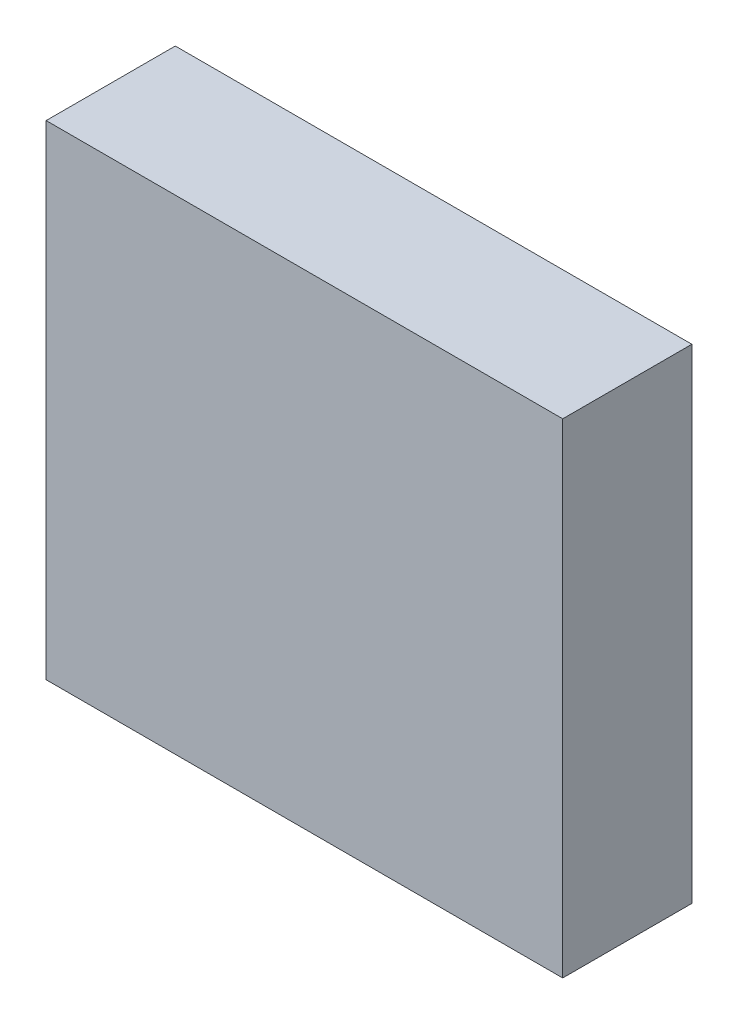
ISO-10303-21;
HEADER;
FILE_DESCRIPTION(('STEP AP214'),'2;1');
FILE_NAME('part.step','',(''),(''),'','','');
FILE_SCHEMA(('AUTOMOTIVE_DESIGN { 1 0 10303 214 1 1 1 1 }'));
ENDSEC;
DATA;
#1=APPLICATION_CONTEXT('core data for automotive mechanical design processes');
#2=APPLICATION_PROTOCOL_DEFINITION('international standard','automotive_design',2000,#1);
#3=PRODUCT_CONTEXT('',#1,'mechanical');
#4=PRODUCT('Part','Part','',(#3));
#5=PRODUCT_RELATED_PRODUCT_CATEGORY('part','',(#4));
#6=PRODUCT_DEFINITION_FORMATION('','',#4);
#7=PRODUCT_DEFINITION_CONTEXT('part definition',#1,'design');
#8=PRODUCT_DEFINITION('design','',#6,#7);
#9=PRODUCT_DEFINITION_SHAPE('','',#8);
#10=(LENGTH_UNIT() NAMED_UNIT(*) SI_UNIT(.MILLI.,.METRE.));
#11=(NAMED_UNIT(*) PLANE_ANGLE_UNIT() SI_UNIT($,.RADIAN.));
#12=(NAMED_UNIT(*) SI_UNIT($,.STERADIAN.) SOLID_ANGLE_UNIT());
#13=UNCERTAINTY_MEASURE_WITH_UNIT(LENGTH_MEASURE(1.E-05),#10,'distance_accuracy_value','');
#14=(GEOMETRIC_REPRESENTATION_CONTEXT(3) GLOBAL_UNCERTAINTY_ASSIGNED_CONTEXT((#13)) GLOBAL_UNIT_ASSIGNED_CONTEXT((#10,
#11,#12)) REPRESENTATION_CONTEXT('',''));
#15=CARTESIAN_POINT('',(0.,0.,0.));
#16=DIRECTION('',(0.,0.,1.));
#17=DIRECTION('',(1.,0.,0.));
#18=AXIS2_PLACEMENT_3D('',#15,#16,#17);
#19=CARTESIAN_POINT('',(0.,0.,0.8));
#20=DIRECTION('',(0.,0.,-1.));
#21=DIRECTION('',(0.,-1.,0.));
#22=AXIS2_PLACEMENT_3D('',#19,#20,#21);
#23=PLANE('',#22);
#24=DIRECTION('',(0.,1.,0.));
#25=VECTOR('',#24,1.);
#26=CARTESIAN_POINT('',(-1.6,-1.5,0.8));
#27=LINE('',#26,#25);
#28=CARTESIAN_POINT('',(-1.6,-1.5,0.8));
#29=VERTEX_POINT('',#28);
#30=CARTESIAN_POINT('',(-1.6,1.5,0.8));
#31=VERTEX_POINT('',#30);
#32=EDGE_CURVE('E27',#29,#31,#27,.T.);
#33=ORIENTED_EDGE('',*,*,#32,.F.);
#34=DIRECTION('',(-1.,0.,0.));
#35=VECTOR('',#34,1.);
#36=CARTESIAN_POINT('',(1.6,-1.5,0.8));
#37=LINE('',#36,#35);
#38=CARTESIAN_POINT('',(1.6,-1.5,0.8));
#39=VERTEX_POINT('',#38);
#40=EDGE_CURVE('E20',#39,#29,#37,.T.);
#41=ORIENTED_EDGE('',*,*,#40,.F.);
#42=DIRECTION('',(0.,-1.,0.));
#43=VECTOR('',#42,1.);
#44=CARTESIAN_POINT('',(1.6,1.5,0.8));
#45=LINE('',#44,#43);
#46=CARTESIAN_POINT('',(1.6,1.5,0.8));
#47=VERTEX_POINT('',#46);
#48=EDGE_CURVE('E85',#47,#39,#45,.T.);
#49=ORIENTED_EDGE('',*,*,#48,.F.);
#50=DIRECTION('',(1.,0.,0.));
#51=VECTOR('',#50,1.);
#52=CARTESIAN_POINT('',(-1.6,1.5,0.8));
#53=LINE('',#52,#51);
#54=EDGE_CURVE('E104',#31,#47,#53,.T.);
#55=ORIENTED_EDGE('',*,*,#54,.F.);
#56=EDGE_LOOP('',(#33,#41,#49,#55));
#57=FACE_BOUND('',#56,.T.);
#58=ADVANCED_FACE('F17',(#57),#23,.F.);
#59=CARTESIAN_POINT('',(0.,0.,0.));
#60=DIRECTION('',(0.,0.,-1.));
#61=DIRECTION('',(0.,-1.,0.));
#62=AXIS2_PLACEMENT_3D('',#59,#60,#61);
#63=PLANE('',#62);
#64=DIRECTION('',(1.,0.,0.));
#65=VECTOR('',#64,1.);
#66=CARTESIAN_POINT('',(-1.6,1.5,0.));
#67=LINE('',#66,#65);
#68=CARTESIAN_POINT('',(-1.6,1.5,0.));
#69=VERTEX_POINT('',#68);
#70=CARTESIAN_POINT('',(1.6,1.5,0.));
#71=VERTEX_POINT('',#70);
#72=EDGE_CURVE('E78',#69,#71,#67,.T.);
#73=ORIENTED_EDGE('',*,*,#72,.T.);
#74=DIRECTION('',(0.,-1.,0.));
#75=VECTOR('',#74,1.);
#76=CARTESIAN_POINT('',(1.6,1.5,0.));
#77=LINE('',#76,#75);
#78=CARTESIAN_POINT('',(1.6,-1.5,0.));
#79=VERTEX_POINT('',#78);
#80=EDGE_CURVE('E75',#71,#79,#77,.T.);
#81=ORIENTED_EDGE('',*,*,#80,.T.);
#82=DIRECTION('',(-1.,0.,0.));
#83=VECTOR('',#82,1.);
#84=CARTESIAN_POINT('',(1.6,-1.5,0.));
#85=LINE('',#84,#83);
#86=CARTESIAN_POINT('',(-1.6,-1.5,0.));
#87=VERTEX_POINT('',#86);
#88=EDGE_CURVE('E63',#79,#87,#85,.T.);
#89=ORIENTED_EDGE('',*,*,#88,.T.);
#90=DIRECTION('',(0.,1.,0.));
#91=VECTOR('',#90,1.);
#92=CARTESIAN_POINT('',(-1.6,-1.5,0.));
#93=LINE('',#92,#91);
#94=EDGE_CURVE('E11',#87,#69,#93,.T.);
#95=ORIENTED_EDGE('',*,*,#94,.T.);
#96=EDGE_LOOP('',(#73,#81,#89,#95));
#97=FACE_BOUND('',#96,.T.);
#98=ADVANCED_FACE('F76',(#97),#63,.T.);
#99=CARTESIAN_POINT('',(-1.6,-1.5,0.));
#100=DIRECTION('',(-1.,0.,0.));
#101=DIRECTION('',(0.,0.,1.));
#102=AXIS2_PLACEMENT_3D('',#99,#100,#101);
#103=PLANE('',#102);
#104=DIRECTION('',(0.,0.,1.));
#105=VECTOR('',#104,1.);
#106=CARTESIAN_POINT('',(-1.6,-1.5,0.));
#107=LINE('',#106,#105);
#108=EDGE_CURVE('E70',#87,#29,#107,.T.);
#109=ORIENTED_EDGE('',*,*,#108,.T.);
#110=ORIENTED_EDGE('',*,*,#32,.T.);
#111=DIRECTION('',(0.,0.,1.));
#112=VECTOR('',#111,1.);
#113=CARTESIAN_POINT('',(-1.6,1.5,0.));
#114=LINE('',#113,#112);
#115=EDGE_CURVE('E101',#69,#31,#114,.T.);
#116=ORIENTED_EDGE('',*,*,#115,.F.);
#117=ORIENTED_EDGE('',*,*,#94,.F.);
#118=EDGE_LOOP('',(#109,#110,#116,#117));
#119=FACE_BOUND('',#118,.T.);
#120=ADVANCED_FACE('F98',(#119),#103,.T.);
#121=CARTESIAN_POINT('',(1.6,-1.5,0.));
#122=DIRECTION('',(0.,-1.,0.));
#123=DIRECTION('',(0.,0.,-1.));
#124=AXIS2_PLACEMENT_3D('',#121,#122,#123);
#125=PLANE('',#124);
#126=DIRECTION('',(0.,0.,1.));
#127=VECTOR('',#126,1.);
#128=CARTESIAN_POINT('',(1.6,-1.5,0.));
#129=LINE('',#128,#127);
#130=EDGE_CURVE('E68',#79,#39,#129,.T.);
#131=ORIENTED_EDGE('',*,*,#130,.T.);
#132=ORIENTED_EDGE('',*,*,#40,.T.);
#133=ORIENTED_EDGE('',*,*,#108,.F.);
#134=ORIENTED_EDGE('',*,*,#88,.F.);
#135=EDGE_LOOP('',(#131,#132,#133,#134));
#136=FACE_BOUND('',#135,.T.);
#137=ADVANCED_FACE('F65',(#136),#125,.T.);
#138=CARTESIAN_POINT('',(1.6,1.5,0.));
#139=DIRECTION('',(1.,0.,0.));
#140=DIRECTION('',(0.,1.,0.));
#141=AXIS2_PLACEMENT_3D('',#138,#139,#140);
#142=PLANE('',#141);
#143=DIRECTION('',(0.,0.,1.));
#144=VECTOR('',#143,1.);
#145=CARTESIAN_POINT('',(1.6,1.5,0.));
#146=LINE('',#145,#144);
#147=EDGE_CURVE('E107',#71,#47,#146,.T.);
#148=ORIENTED_EDGE('',*,*,#147,.T.);
#149=ORIENTED_EDGE('',*,*,#48,.T.);
#150=ORIENTED_EDGE('',*,*,#130,.F.);
#151=ORIENTED_EDGE('',*,*,#80,.F.);
#152=EDGE_LOOP('',(#148,#149,#150,#151));
#153=FACE_BOUND('',#152,.T.);
#154=ADVANCED_FACE('F84',(#153),#142,.T.);
#155=CARTESIAN_POINT('',(-1.6,1.5,0.));
#156=DIRECTION('',(0.,1.,0.));
#157=DIRECTION('',(1.,0.,0.));
#158=AXIS2_PLACEMENT_3D('',#155,#156,#157);
#159=PLANE('',#158);
#160=ORIENTED_EDGE('',*,*,#115,.T.);
#161=ORIENTED_EDGE('',*,*,#54,.T.);
#162=ORIENTED_EDGE('',*,*,#147,.F.);
#163=ORIENTED_EDGE('',*,*,#72,.F.);
#164=EDGE_LOOP('',(#160,#161,#162,#163));
#165=FACE_BOUND('',#164,.T.);
#166=ADVANCED_FACE('F109',(#165),#159,.T.);
#167=CLOSED_SHELL('',(#58,#98,#120,#137,#154,#166));
#168=MANIFOLD_SOLID_BREP('B1',#167);
#169=ADVANCED_BREP_SHAPE_REPRESENTATION('',(#18,#168),#14);
#170=SHAPE_DEFINITION_REPRESENTATION(#9,#169);
ENDSEC;
END-ISO-10303-21;
